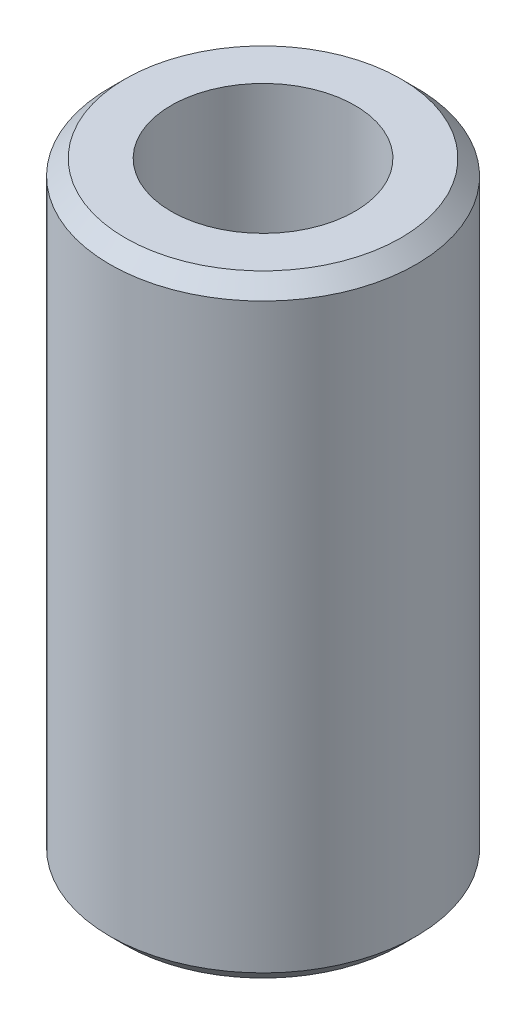
ISO-10303-21;
HEADER;
FILE_DESCRIPTION(('STEP AP214'),'2;1');
FILE_NAME('part.step','',(''),(''),'','','');
FILE_SCHEMA(('AUTOMOTIVE_DESIGN { 1 0 10303 214 1 1 1 1 }'));
ENDSEC;
DATA;
#1=APPLICATION_CONTEXT('core data for automotive mechanical design processes');
#2=APPLICATION_PROTOCOL_DEFINITION('international standard','automotive_design',2000,#1);
#3=PRODUCT_CONTEXT('',#1,'mechanical');
#4=PRODUCT('Part','Part','',(#3));
#5=PRODUCT_RELATED_PRODUCT_CATEGORY('part','',(#4));
#6=PRODUCT_DEFINITION_FORMATION('','',#4);
#7=PRODUCT_DEFINITION_CONTEXT('part definition',#1,'design');
#8=PRODUCT_DEFINITION('design','',#6,#7);
#9=PRODUCT_DEFINITION_SHAPE('','',#8);
#10=(LENGTH_UNIT() NAMED_UNIT(*) SI_UNIT(.MILLI.,.METRE.));
#11=(NAMED_UNIT(*) PLANE_ANGLE_UNIT() SI_UNIT($,.RADIAN.));
#12=(NAMED_UNIT(*) SI_UNIT($,.STERADIAN.) SOLID_ANGLE_UNIT());
#13=UNCERTAINTY_MEASURE_WITH_UNIT(LENGTH_MEASURE(1.E-05),#10,'distance_accuracy_value','');
#14=(GEOMETRIC_REPRESENTATION_CONTEXT(3) GLOBAL_UNCERTAINTY_ASSIGNED_CONTEXT((#13)) GLOBAL_UNIT_ASSIGNED_CONTEXT((#10,
#11,#12)) REPRESENTATION_CONTEXT('',''));
#15=CARTESIAN_POINT('',(0.,0.,0.));
#16=DIRECTION('',(0.,0.,1.));
#17=DIRECTION('',(1.,0.,0.));
#18=AXIS2_PLACEMENT_3D('',#15,#16,#17);
#19=CARTESIAN_POINT('',(0.,10.,0.));
#20=DIRECTION('',(0.,1.,0.));
#21=DIRECTION('',(0.,0.,1.));
#22=AXIS2_PLACEMENT_3D('',#19,#20,#21);
#23=PLANE('',#22);
#24=CARTESIAN_POINT('',(0.,10.,0.));
#25=DIRECTION('',(0.,1.,0.));
#26=DIRECTION('',(0.,0.,1.));
#27=AXIS2_PLACEMENT_3D('',#24,#25,#26);
#28=CIRCLE('',#27,4.5);
#29=CARTESIAN_POINT('',(0.,10.,4.5));
#30=VERTEX_POINT('',#29);
#31=EDGE_CURVE('E46',#30,#30,#28,.T.);
#32=ORIENTED_EDGE('',*,*,#31,.T.);
#33=EDGE_LOOP('',(#32));
#34=FACE_BOUND('',#33,.T.);
#35=CARTESIAN_POINT('',(0.,10.,0.));
#36=DIRECTION('',(0.,1.,0.));
#37=DIRECTION('',(0.,0.,1.));
#38=AXIS2_PLACEMENT_3D('',#35,#36,#37);
#39=CIRCLE('',#38,3.);
#40=CARTESIAN_POINT('',(0.,10.,3.));
#41=VERTEX_POINT('',#40);
#42=EDGE_CURVE('E51',#41,#41,#39,.T.);
#43=ORIENTED_EDGE('',*,*,#42,.F.);
#44=EDGE_LOOP('',(#43));
#45=FACE_BOUND('',#44,.T.);
#46=ADVANCED_FACE('F31',(#34,#45),#23,.T.);
#47=CARTESIAN_POINT('',(0.,-10.,0.));
#48=DIRECTION('',(0.,1.,0.));
#49=DIRECTION('',(0.,0.,1.));
#50=AXIS2_PLACEMENT_3D('',#47,#48,#49);
#51=PLANE('',#50);
#52=CARTESIAN_POINT('',(0.,-10.,0.));
#53=DIRECTION('',(0.,1.,0.));
#54=DIRECTION('',(0.,0.,1.));
#55=AXIS2_PLACEMENT_3D('',#52,#53,#54);
#56=CIRCLE('',#55,4.5);
#57=CARTESIAN_POINT('',(0.,-10.,4.5));
#58=VERTEX_POINT('',#57);
#59=EDGE_CURVE('E10',#58,#58,#56,.F.);
#60=ORIENTED_EDGE('',*,*,#59,.T.);
#61=EDGE_LOOP('',(#60));
#62=FACE_BOUND('',#61,.T.);
#63=CARTESIAN_POINT('',(0.,-10.,0.));
#64=DIRECTION('',(0.,1.,0.));
#65=DIRECTION('',(0.,0.,1.));
#66=AXIS2_PLACEMENT_3D('',#63,#64,#65);
#67=CIRCLE('',#66,3.);
#68=CARTESIAN_POINT('',(0.,-10.,3.));
#69=VERTEX_POINT('',#68);
#70=EDGE_CURVE('E52',#69,#69,#67,.T.);
#71=ORIENTED_EDGE('',*,*,#70,.T.);
#72=EDGE_LOOP('',(#71));
#73=FACE_BOUND('',#72,.T.);
#74=ADVANCED_FACE('F62',(#62,#73),#51,.F.);
#75=CARTESIAN_POINT('',(0.,10.,0.));
#76=DIRECTION('',(0.,-1.,0.));
#77=DIRECTION('',(0.,0.,-1.));
#78=AXIS2_PLACEMENT_3D('',#75,#76,#77);
#79=CYLINDRICAL_SURFACE('',#78,5.);
#80=CARTESIAN_POINT('',(0.,9.5,0.));
#81=DIRECTION('',(0.,1.,0.));
#82=DIRECTION('',(0.,0.,1.));
#83=AXIS2_PLACEMENT_3D('',#80,#81,#82);
#84=CIRCLE('',#83,5.);
#85=CARTESIAN_POINT('',(0.,9.5,5.));
#86=VERTEX_POINT('',#85);
#87=EDGE_CURVE('E38',#86,#86,#84,.F.);
#88=ORIENTED_EDGE('',*,*,#87,.T.);
#89=EDGE_LOOP('',(#88));
#90=FACE_BOUND('',#89,.T.);
#91=CARTESIAN_POINT('',(0.,-9.5,0.));
#92=DIRECTION('',(0.,1.,0.));
#93=DIRECTION('',(0.,0.,1.));
#94=AXIS2_PLACEMENT_3D('',#91,#92,#93);
#95=CIRCLE('',#94,5.);
#96=CARTESIAN_POINT('',(0.,-9.5,5.));
#97=VERTEX_POINT('',#96);
#98=EDGE_CURVE('E42',#97,#97,#95,.T.);
#99=ORIENTED_EDGE('',*,*,#98,.T.);
#100=EDGE_LOOP('',(#99));
#101=FACE_BOUND('',#100,.T.);
#102=ADVANCED_FACE('F68',(#90,#101),#79,.T.);
#103=CARTESIAN_POINT('',(0.,10.,0.));
#104=DIRECTION('',(0.,-1.,0.));
#105=DIRECTION('',(0.,0.,-1.));
#106=AXIS2_PLACEMENT_3D('',#103,#104,#105);
#107=CYLINDRICAL_SURFACE('',#106,3.);
#108=ORIENTED_EDGE('',*,*,#42,.T.);
#109=EDGE_LOOP('',(#108));
#110=FACE_BOUND('',#109,.T.);
#111=ORIENTED_EDGE('',*,*,#70,.F.);
#112=EDGE_LOOP('',(#111));
#113=FACE_BOUND('',#112,.T.);
#114=ADVANCED_FACE('F58',(#110,#113),#107,.F.);
#115=CARTESIAN_POINT('',(0.,10.,0.));
#116=DIRECTION('',(0.,-1.,0.));
#117=DIRECTION('',(0.,0.,-1.));
#118=AXIS2_PLACEMENT_3D('',#115,#116,#117);
#119=CONICAL_SURFACE('',#118,4.5,0.785398163397446);
#120=ORIENTED_EDGE('',*,*,#87,.F.);
#121=EDGE_LOOP('',(#120));
#122=FACE_BOUND('',#121,.T.);
#123=ORIENTED_EDGE('',*,*,#31,.F.);
#124=EDGE_LOOP('',(#123));
#125=FACE_BOUND('',#124,.T.);
#126=ADVANCED_FACE('F73',(#122,#125),#119,.T.);
#127=CARTESIAN_POINT('',(0.,-9.5,0.));
#128=DIRECTION('',(0.,1.,0.));
#129=DIRECTION('',(0.,0.,1.));
#130=AXIS2_PLACEMENT_3D('',#127,#128,#129);
#131=CONICAL_SURFACE('',#130,5.,0.785398163397449);
#132=ORIENTED_EDGE('',*,*,#59,.F.);
#133=EDGE_LOOP('',(#132));
#134=FACE_BOUND('',#133,.T.);
#135=ORIENTED_EDGE('',*,*,#98,.F.);
#136=EDGE_LOOP('',(#135));
#137=FACE_BOUND('',#136,.T.);
#138=ADVANCED_FACE('F33',(#134,#137),#131,.T.);
#139=CLOSED_SHELL('',(#46,#74,#102,#114,#126,#138));
#140=MANIFOLD_SOLID_BREP('B2',#139);
#141=ADVANCED_BREP_SHAPE_REPRESENTATION('',(#18,#140),#14);
#142=SHAPE_DEFINITION_REPRESENTATION(#9,#141);
ENDSEC;
END-ISO-10303-21;
